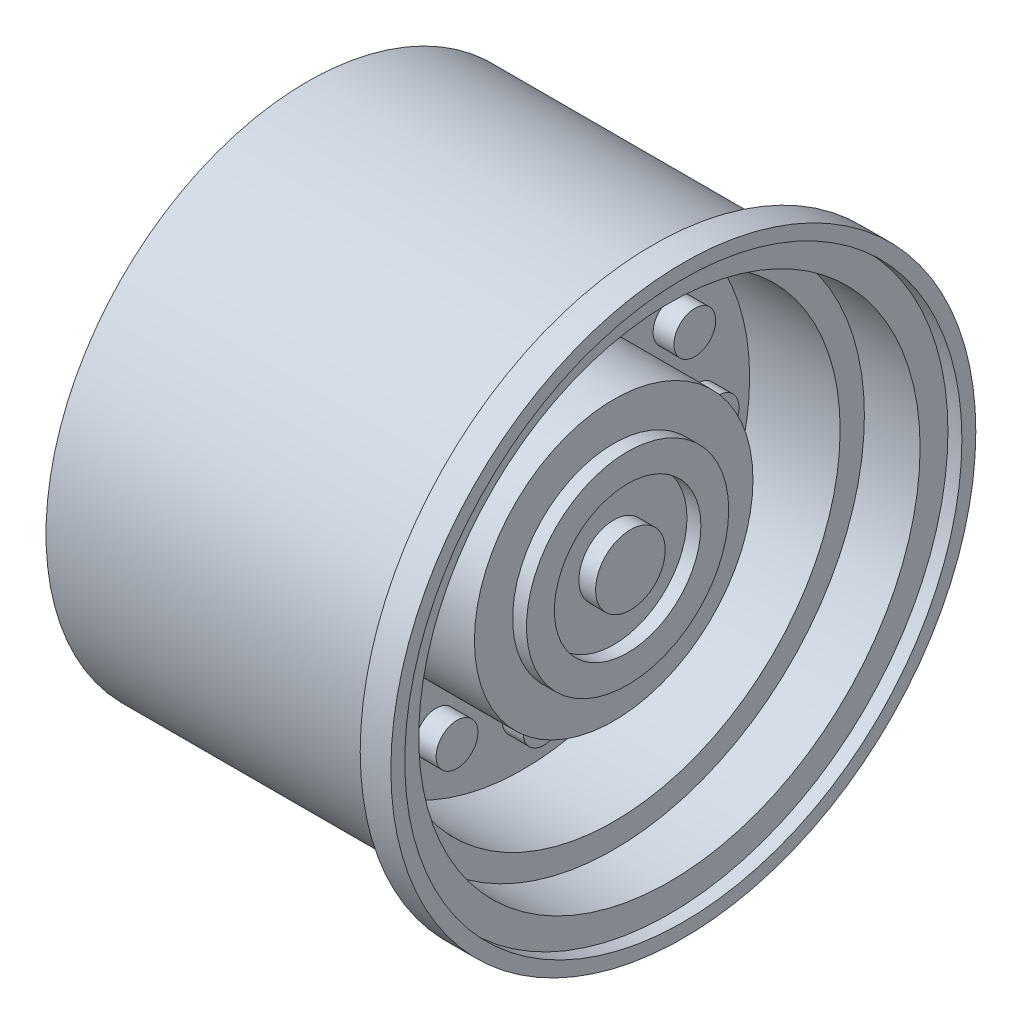
ISO-10303-21;
HEADER;
FILE_DESCRIPTION(('STEP AP214'),'2;1');
FILE_NAME('part.step','',(''),(''),'','','');
FILE_SCHEMA(('AUTOMOTIVE_DESIGN { 1 0 10303 214 1 1 1 1 }'));
ENDSEC;
DATA;
#1=APPLICATION_CONTEXT('core data for automotive mechanical design processes');
#2=APPLICATION_PROTOCOL_DEFINITION('international standard','automotive_design',2000,#1);
#3=PRODUCT_CONTEXT('',#1,'mechanical');
#4=PRODUCT('Part','Part','',(#3));
#5=PRODUCT_RELATED_PRODUCT_CATEGORY('part','',(#4));
#6=PRODUCT_DEFINITION_FORMATION('','',#4);
#7=PRODUCT_DEFINITION_CONTEXT('part definition',#1,'design');
#8=PRODUCT_DEFINITION('design','',#6,#7);
#9=PRODUCT_DEFINITION_SHAPE('','',#8);
#10=(LENGTH_UNIT() NAMED_UNIT(*) SI_UNIT(.MILLI.,.METRE.));
#11=(NAMED_UNIT(*) PLANE_ANGLE_UNIT() SI_UNIT($,.RADIAN.));
#12=(NAMED_UNIT(*) SI_UNIT($,.STERADIAN.) SOLID_ANGLE_UNIT());
#13=UNCERTAINTY_MEASURE_WITH_UNIT(LENGTH_MEASURE(1.E-05),#10,'distance_accuracy_value','');
#14=(GEOMETRIC_REPRESENTATION_CONTEXT(3) GLOBAL_UNCERTAINTY_ASSIGNED_CONTEXT((#13)) GLOBAL_UNIT_ASSIGNED_CONTEXT((#10,
#11,#12)) REPRESENTATION_CONTEXT('',''));
#15=CARTESIAN_POINT('',(0.,0.,0.));
#16=DIRECTION('',(0.,0.,1.));
#17=DIRECTION('',(1.,0.,0.));
#18=AXIS2_PLACEMENT_3D('',#15,#16,#17);
#19=CARTESIAN_POINT('',(4.69,3.63,0.));
#20=DIRECTION('',(1.,0.,0.));
#21=DIRECTION('',(0.,0.,-1.));
#22=AXIS2_PLACEMENT_3D('',#19,#20,#21);
#23=PLANE('',#22);
#24=CARTESIAN_POINT('',(4.69,0.,0.));
#25=DIRECTION('',(1.,0.,0.));
#26=DIRECTION('',(0.,0.,-1.));
#27=AXIS2_PLACEMENT_3D('',#24,#25,#26);
#28=CIRCLE('',#27,2.63);
#29=CARTESIAN_POINT('',(4.69,0.,-2.63));
#30=VERTEX_POINT('',#29);
#31=EDGE_CURVE('E179',#30,#30,#28,.T.);
#32=ORIENTED_EDGE('',*,*,#31,.F.);
#33=EDGE_LOOP('',(#32));
#34=FACE_BOUND('',#33,.T.);
#35=CARTESIAN_POINT('',(4.69,0.,0.));
#36=DIRECTION('',(1.,0.,0.));
#37=DIRECTION('',(0.,0.,-1.));
#38=AXIS2_PLACEMENT_3D('',#35,#36,#37);
#39=CIRCLE('',#38,3.63);
#40=CARTESIAN_POINT('',(4.69,0.,-3.63));
#41=VERTEX_POINT('',#40);
#42=EDGE_CURVE('E103',#41,#41,#39,.T.);
#43=ORIENTED_EDGE('',*,*,#42,.T.);
#44=EDGE_LOOP('',(#43));
#45=FACE_BOUND('',#44,.T.);
#46=ADVANCED_FACE('F33',(#34,#45),#23,.T.);
#47=CARTESIAN_POINT('',(-4.56,0.,0.));
#48=DIRECTION('',(-1.,0.,0.));
#49=DIRECTION('',(0.,0.,1.));
#50=AXIS2_PLACEMENT_3D('',#47,#48,#49);
#51=PLANE('',#50);
#52=CARTESIAN_POINT('',(-4.56,0.,0.));
#53=DIRECTION('',(-1.,0.,0.));
#54=DIRECTION('',(0.,0.,1.));
#55=AXIS2_PLACEMENT_3D('',#52,#53,#54);
#56=CIRCLE('',#55,1.25);
#57=CARTESIAN_POINT('',(-4.56,0.,1.25));
#58=VERTEX_POINT('',#57);
#59=EDGE_CURVE('E191',#58,#58,#56,.T.);
#60=ORIENTED_EDGE('',*,*,#59,.F.);
#61=EDGE_LOOP('',(#60));
#62=FACE_BOUND('',#61,.T.);
#63=CARTESIAN_POINT('',(-4.56,0.,0.));
#64=DIRECTION('',(1.,0.,0.));
#65=DIRECTION('',(0.,0.,-1.));
#66=AXIS2_PLACEMENT_3D('',#63,#64,#65);
#67=CIRCLE('',#66,3.25);
#68=CARTESIAN_POINT('',(-4.56,0.,-3.25));
#69=VERTEX_POINT('',#68);
#70=EDGE_CURVE('E10',#69,#69,#67,.T.);
#71=ORIENTED_EDGE('',*,*,#70,.F.);
#72=EDGE_LOOP('',(#71));
#73=FACE_BOUND('',#72,.T.);
#74=ADVANCED_FACE('F206',(#62,#73),#51,.T.);
#75=CARTESIAN_POINT('',(4.69,0.,0.));
#76=DIRECTION('',(1.,0.,0.));
#77=DIRECTION('',(0.,0.,-1.));
#78=AXIS2_PLACEMENT_3D('',#75,#76,#77);
#79=CYLINDRICAL_SURFACE('',#78,3.25);
#80=ORIENTED_EDGE('',*,*,#70,.T.);
#81=EDGE_LOOP('',(#80));
#82=FACE_BOUND('',#81,.T.);
#83=CARTESIAN_POINT('',(-3.81,0.,0.));
#84=DIRECTION('',(1.,0.,0.));
#85=DIRECTION('',(0.,0.,-1.));
#86=AXIS2_PLACEMENT_3D('',#83,#84,#85);
#87=CIRCLE('',#86,3.25);
#88=CARTESIAN_POINT('',(-3.81,0.,-3.25));
#89=VERTEX_POINT('',#88);
#90=EDGE_CURVE('E39',#89,#89,#87,.T.);
#91=ORIENTED_EDGE('',*,*,#90,.F.);
#92=EDGE_LOOP('',(#91));
#93=FACE_BOUND('',#92,.T.);
#94=ADVANCED_FACE('F209',(#82,#93),#79,.T.);
#95=CARTESIAN_POINT('',(-3.81,3.25,0.));
#96=DIRECTION('',(-1.,0.,0.));
#97=DIRECTION('',(0.,0.,1.));
#98=AXIS2_PLACEMENT_3D('',#95,#96,#97);
#99=PLANE('',#98);
#100=ORIENTED_EDGE('',*,*,#90,.T.);
#101=EDGE_LOOP('',(#100));
#102=FACE_BOUND('',#101,.T.);
#103=CARTESIAN_POINT('',(-3.81,0.,0.));
#104=DIRECTION('',(1.,0.,0.));
#105=DIRECTION('',(0.,0.,-1.));
#106=AXIS2_PLACEMENT_3D('',#103,#104,#105);
#107=CIRCLE('',#106,4.5);
#108=CARTESIAN_POINT('',(-3.81,0.,-4.5));
#109=VERTEX_POINT('',#108);
#110=EDGE_CURVE('E43',#109,#109,#107,.T.);
#111=ORIENTED_EDGE('',*,*,#110,.F.);
#112=EDGE_LOOP('',(#111));
#113=FACE_BOUND('',#112,.T.);
#114=ADVANCED_FACE('F214',(#102,#113),#99,.T.);
#115=CARTESIAN_POINT('',(4.69,0.,0.));
#116=DIRECTION('',(1.,0.,0.));
#117=DIRECTION('',(0.,0.,-1.));
#118=AXIS2_PLACEMENT_3D('',#115,#116,#117);
#119=CYLINDRICAL_SURFACE('',#118,4.5);
#120=ORIENTED_EDGE('',*,*,#110,.T.);
#121=EDGE_LOOP('',(#120));
#122=FACE_BOUND('',#121,.T.);
#123=CARTESIAN_POINT('',(-2.91,0.,0.));
#124=DIRECTION('',(1.,0.,0.));
#125=DIRECTION('',(0.,0.,-1.));
#126=AXIS2_PLACEMENT_3D('',#123,#124,#125);
#127=CIRCLE('',#126,4.5);
#128=CARTESIAN_POINT('',(-2.91,0.,-4.5));
#129=VERTEX_POINT('',#128);
#130=EDGE_CURVE('E47',#129,#129,#127,.T.);
#131=ORIENTED_EDGE('',*,*,#130,.F.);
#132=EDGE_LOOP('',(#131));
#133=FACE_BOUND('',#132,.T.);
#134=ADVANCED_FACE('F220',(#122,#133),#119,.T.);
#135=CARTESIAN_POINT('',(-2.91,4.5,0.));
#136=DIRECTION('',(-1.,0.,0.));
#137=DIRECTION('',(0.,0.,1.));
#138=AXIS2_PLACEMENT_3D('',#135,#136,#137);
#139=PLANE('',#138);
#140=ORIENTED_EDGE('',*,*,#130,.T.);
#141=EDGE_LOOP('',(#140));
#142=FACE_BOUND('',#141,.T.);
#143=CARTESIAN_POINT('',(-2.91,0.,0.));
#144=DIRECTION('',(1.,0.,0.));
#145=DIRECTION('',(0.,0.,-1.));
#146=AXIS2_PLACEMENT_3D('',#143,#144,#145);
#147=CIRCLE('',#146,8.13);
#148=CARTESIAN_POINT('',(-2.91,0.,-8.13));
#149=VERTEX_POINT('',#148);
#150=EDGE_CURVE('E52',#149,#149,#147,.T.);
#151=ORIENTED_EDGE('',*,*,#150,.F.);
#152=EDGE_LOOP('',(#151));
#153=FACE_BOUND('',#152,.T.);
#154=ADVANCED_FACE('F223',(#142,#153),#139,.T.);
#155=CARTESIAN_POINT('',(4.69,0.,0.));
#156=DIRECTION('',(1.,0.,0.));
#157=DIRECTION('',(0.,0.,-1.));
#158=AXIS2_PLACEMENT_3D('',#155,#156,#157);
#159=CYLINDRICAL_SURFACE('',#158,8.13);
#160=ORIENTED_EDGE('',*,*,#150,.T.);
#161=EDGE_LOOP('',(#160));
#162=FACE_BOUND('',#161,.T.);
#163=CARTESIAN_POINT('',(-5.31,0.,0.));
#164=DIRECTION('',(1.,0.,0.));
#165=DIRECTION('',(0.,0.,-1.));
#166=AXIS2_PLACEMENT_3D('',#163,#164,#165);
#167=CIRCLE('',#166,8.13);
#168=CARTESIAN_POINT('',(-5.31,0.,-8.13));
#169=VERTEX_POINT('',#168);
#170=EDGE_CURVE('E55',#169,#169,#167,.T.);
#171=ORIENTED_EDGE('',*,*,#170,.F.);
#172=EDGE_LOOP('',(#171));
#173=FACE_BOUND('',#172,.T.);
#174=ADVANCED_FACE('F227',(#162,#173),#159,.F.);
#175=CARTESIAN_POINT('',(-5.31,8.13,0.));
#176=DIRECTION('',(-1.,0.,0.));
#177=DIRECTION('',(0.,0.,1.));
#178=AXIS2_PLACEMENT_3D('',#175,#176,#177);
#179=PLANE('',#178);
#180=ORIENTED_EDGE('',*,*,#170,.T.);
#181=EDGE_LOOP('',(#180));
#182=FACE_BOUND('',#181,.T.);
#183=CARTESIAN_POINT('',(-5.31,0.,0.));
#184=DIRECTION('',(1.,0.,0.));
#185=DIRECTION('',(0.,0.,-1.));
#186=AXIS2_PLACEMENT_3D('',#183,#184,#185);
#187=CIRCLE('',#186,8.5);
#188=CARTESIAN_POINT('',(-5.31,0.,-8.5));
#189=VERTEX_POINT('',#188);
#190=EDGE_CURVE('E58',#189,#189,#187,.T.);
#191=ORIENTED_EDGE('',*,*,#190,.F.);
#192=EDGE_LOOP('',(#191));
#193=FACE_BOUND('',#192,.T.);
#194=ADVANCED_FACE('F231',(#182,#193),#179,.T.);
#195=CARTESIAN_POINT('',(4.69,0.,0.));
#196=DIRECTION('',(1.,0.,0.));
#197=DIRECTION('',(0.,0.,-1.));
#198=AXIS2_PLACEMENT_3D('',#195,#196,#197);
#199=CYLINDRICAL_SURFACE('',#198,8.5);
#200=ORIENTED_EDGE('',*,*,#190,.T.);
#201=EDGE_LOOP('',(#200));
#202=FACE_BOUND('',#201,.T.);
#203=CARTESIAN_POINT('',(-6.81,0.,0.));
#204=DIRECTION('',(1.,0.,0.));
#205=DIRECTION('',(0.,0.,-1.));
#206=AXIS2_PLACEMENT_3D('',#203,#204,#205);
#207=CIRCLE('',#206,8.5);
#208=CARTESIAN_POINT('',(-6.81,0.,-8.5));
#209=VERTEX_POINT('',#208);
#210=EDGE_CURVE('E61',#209,#209,#207,.T.);
#211=ORIENTED_EDGE('',*,*,#210,.F.);
#212=EDGE_LOOP('',(#211));
#213=FACE_BOUND('',#212,.T.);
#214=ADVANCED_FACE('F235',(#202,#213),#199,.F.);
#215=CARTESIAN_POINT('',(-6.81,8.5,0.));
#216=DIRECTION('',(-1.,0.,0.));
#217=DIRECTION('',(0.,0.,1.));
#218=AXIS2_PLACEMENT_3D('',#215,#216,#217);
#219=PLANE('',#218);
#220=ORIENTED_EDGE('',*,*,#210,.T.);
#221=EDGE_LOOP('',(#220));
#222=FACE_BOUND('',#221,.T.);
#223=CARTESIAN_POINT('',(-6.81,0.,0.));
#224=DIRECTION('',(1.,0.,0.));
#225=DIRECTION('',(0.,0.,-1.));
#226=AXIS2_PLACEMENT_3D('',#223,#224,#225);
#227=CIRCLE('',#226,9.38);
#228=CARTESIAN_POINT('',(-6.81,0.,-9.38));
#229=VERTEX_POINT('',#228);
#230=EDGE_CURVE('E64',#229,#229,#227,.T.);
#231=ORIENTED_EDGE('',*,*,#230,.F.);
#232=EDGE_LOOP('',(#231));
#233=FACE_BOUND('',#232,.T.);
#234=ADVANCED_FACE('F239',(#222,#233),#219,.T.);
#235=CARTESIAN_POINT('',(4.69,0.,0.));
#236=DIRECTION('',(1.,0.,0.));
#237=DIRECTION('',(0.,0.,-1.));
#238=AXIS2_PLACEMENT_3D('',#235,#236,#237);
#239=CYLINDRICAL_SURFACE('',#238,9.38);
#240=ORIENTED_EDGE('',*,*,#230,.T.);
#241=EDGE_LOOP('',(#240));
#242=FACE_BOUND('',#241,.T.);
#243=CARTESIAN_POINT('',(5.59,0.,0.));
#244=DIRECTION('',(1.,0.,0.));
#245=DIRECTION('',(0.,0.,-1.));
#246=AXIS2_PLACEMENT_3D('',#243,#244,#245);
#247=CIRCLE('',#246,9.38);
#248=CARTESIAN_POINT('',(5.59,0.,-9.38));
#249=VERTEX_POINT('',#248);
#250=EDGE_CURVE('E67',#249,#249,#247,.T.);
#251=ORIENTED_EDGE('',*,*,#250,.F.);
#252=EDGE_LOOP('',(#251));
#253=FACE_BOUND('',#252,.T.);
#254=ADVANCED_FACE('F243',(#242,#253),#239,.T.);
#255=CARTESIAN_POINT('',(5.59,9.38,0.));
#256=DIRECTION('',(-1.,0.,0.));
#257=DIRECTION('',(0.,0.,1.));
#258=AXIS2_PLACEMENT_3D('',#255,#256,#257);
#259=PLANE('',#258);
#260=ORIENTED_EDGE('',*,*,#250,.T.);
#261=EDGE_LOOP('',(#260));
#262=FACE_BOUND('',#261,.T.);
#263=CARTESIAN_POINT('',(5.59,0.,0.));
#264=DIRECTION('',(1.,0.,0.));
#265=DIRECTION('',(0.,0.,-1.));
#266=AXIS2_PLACEMENT_3D('',#263,#264,#265);
#267=CIRCLE('',#266,10.5);
#268=CARTESIAN_POINT('',(5.59,0.,-10.5));
#269=VERTEX_POINT('',#268);
#270=EDGE_CURVE('E70',#269,#269,#267,.T.);
#271=ORIENTED_EDGE('',*,*,#270,.F.);
#272=EDGE_LOOP('',(#271));
#273=FACE_BOUND('',#272,.T.);
#274=ADVANCED_FACE('F247',(#262,#273),#259,.T.);
#275=CARTESIAN_POINT('',(4.69,0.,0.));
#276=DIRECTION('',(1.,0.,0.));
#277=DIRECTION('',(0.,0.,-1.));
#278=AXIS2_PLACEMENT_3D('',#275,#276,#277);
#279=CYLINDRICAL_SURFACE('',#278,10.5);
#280=ORIENTED_EDGE('',*,*,#270,.T.);
#281=EDGE_LOOP('',(#280));
#282=FACE_BOUND('',#281,.T.);
#283=CARTESIAN_POINT('',(6.69,0.,0.));
#284=DIRECTION('',(1.,0.,0.));
#285=DIRECTION('',(0.,0.,-1.));
#286=AXIS2_PLACEMENT_3D('',#283,#284,#285);
#287=CIRCLE('',#286,10.5);
#288=CARTESIAN_POINT('',(6.69,0.,-10.5));
#289=VERTEX_POINT('',#288);
#290=EDGE_CURVE('E73',#289,#289,#287,.T.);
#291=ORIENTED_EDGE('',*,*,#290,.F.);
#292=EDGE_LOOP('',(#291));
#293=FACE_BOUND('',#292,.T.);
#294=ADVANCED_FACE('F251',(#282,#293),#279,.T.);
#295=CARTESIAN_POINT('',(6.69,10.5,0.));
#296=DIRECTION('',(1.,0.,0.));
#297=DIRECTION('',(0.,0.,-1.));
#298=AXIS2_PLACEMENT_3D('',#295,#296,#297);
#299=PLANE('',#298);
#300=ORIENTED_EDGE('',*,*,#290,.T.);
#301=EDGE_LOOP('',(#300));
#302=FACE_BOUND('',#301,.T.);
#303=CARTESIAN_POINT('',(6.69,0.,0.));
#304=DIRECTION('',(1.,0.,0.));
#305=DIRECTION('',(0.,0.,-1.));
#306=AXIS2_PLACEMENT_3D('',#303,#304,#305);
#307=CIRCLE('',#306,10.);
#308=CARTESIAN_POINT('',(6.69,0.,-10.));
#309=VERTEX_POINT('',#308);
#310=EDGE_CURVE('E76',#309,#309,#307,.T.);
#311=ORIENTED_EDGE('',*,*,#310,.F.);
#312=EDGE_LOOP('',(#311));
#313=FACE_BOUND('',#312,.T.);
#314=ADVANCED_FACE('F255',(#302,#313),#299,.T.);
#315=CARTESIAN_POINT('',(4.69,0.,0.));
#316=DIRECTION('',(1.,0.,0.));
#317=DIRECTION('',(0.,0.,-1.));
#318=AXIS2_PLACEMENT_3D('',#315,#316,#317);
#319=CYLINDRICAL_SURFACE('',#318,10.);
#320=ORIENTED_EDGE('',*,*,#310,.T.);
#321=EDGE_LOOP('',(#320));
#322=FACE_BOUND('',#321,.T.);
#323=CARTESIAN_POINT('',(6.19,0.,0.));
#324=DIRECTION('',(1.,0.,0.));
#325=DIRECTION('',(0.,0.,-1.));
#326=AXIS2_PLACEMENT_3D('',#323,#324,#325);
#327=CIRCLE('',#326,10.);
#328=CARTESIAN_POINT('',(6.19,0.,-10.));
#329=VERTEX_POINT('',#328);
#330=EDGE_CURVE('E79',#329,#329,#327,.T.);
#331=ORIENTED_EDGE('',*,*,#330,.F.);
#332=EDGE_LOOP('',(#331));
#333=FACE_BOUND('',#332,.T.);
#334=ADVANCED_FACE('F259',(#322,#333),#319,.F.);
#335=CARTESIAN_POINT('',(6.19,10.,0.));
#336=DIRECTION('',(1.,0.,0.));
#337=DIRECTION('',(0.,0.,-1.));
#338=AXIS2_PLACEMENT_3D('',#335,#336,#337);
#339=PLANE('',#338);
#340=ORIENTED_EDGE('',*,*,#330,.T.);
#341=EDGE_LOOP('',(#340));
#342=FACE_BOUND('',#341,.T.);
#343=CARTESIAN_POINT('',(6.19,0.,0.));
#344=DIRECTION('',(1.,0.,0.));
#345=DIRECTION('',(0.,0.,-1.));
#346=AXIS2_PLACEMENT_3D('',#343,#344,#345);
#347=CIRCLE('',#346,9.);
#348=CARTESIAN_POINT('',(6.19,0.,-9.));
#349=VERTEX_POINT('',#348);
#350=EDGE_CURVE('E82',#349,#349,#347,.T.);
#351=ORIENTED_EDGE('',*,*,#350,.F.);
#352=EDGE_LOOP('',(#351));
#353=FACE_BOUND('',#352,.T.);
#354=ADVANCED_FACE('F263',(#342,#353),#339,.T.);
#355=CARTESIAN_POINT('',(4.69,0.,0.));
#356=DIRECTION('',(1.,0.,0.));
#357=DIRECTION('',(0.,0.,-1.));
#358=AXIS2_PLACEMENT_3D('',#355,#356,#357);
#359=CYLINDRICAL_SURFACE('',#358,9.);
#360=ORIENTED_EDGE('',*,*,#350,.T.);
#361=EDGE_LOOP('',(#360));
#362=FACE_BOUND('',#361,.T.);
#363=CARTESIAN_POINT('',(4.19,0.,0.));
#364=DIRECTION('',(1.,0.,0.));
#365=DIRECTION('',(0.,0.,-1.));
#366=AXIS2_PLACEMENT_3D('',#363,#364,#365);
#367=CIRCLE('',#366,9.);
#368=CARTESIAN_POINT('',(4.19,0.,-9.));
#369=VERTEX_POINT('',#368);
#370=EDGE_CURVE('E85',#369,#369,#367,.T.);
#371=ORIENTED_EDGE('',*,*,#370,.F.);
#372=EDGE_LOOP('',(#371));
#373=FACE_BOUND('',#372,.T.);
#374=ADVANCED_FACE('F267',(#362,#373),#359,.F.);
#375=CARTESIAN_POINT('',(4.19,9.,0.));
#376=DIRECTION('',(1.,0.,0.));
#377=DIRECTION('',(0.,0.,-1.));
#378=AXIS2_PLACEMENT_3D('',#375,#376,#377);
#379=PLANE('',#378);
#380=ORIENTED_EDGE('',*,*,#370,.T.);
#381=EDGE_LOOP('',(#380));
#382=FACE_BOUND('',#381,.T.);
#383=CARTESIAN_POINT('',(4.19,0.,0.));
#384=DIRECTION('',(1.,0.,0.));
#385=DIRECTION('',(0.,0.,-1.));
#386=AXIS2_PLACEMENT_3D('',#383,#384,#385);
#387=CIRCLE('',#386,8.13);
#388=CARTESIAN_POINT('',(4.19,0.,-8.13));
#389=VERTEX_POINT('',#388);
#390=EDGE_CURVE('E88',#389,#389,#387,.T.);
#391=ORIENTED_EDGE('',*,*,#390,.F.);
#392=EDGE_LOOP('',(#391));
#393=FACE_BOUND('',#392,.T.);
#394=ADVANCED_FACE('F271',(#382,#393),#379,.T.);
#395=CARTESIAN_POINT('',(4.69,0.,0.));
#396=DIRECTION('',(1.,0.,0.));
#397=DIRECTION('',(0.,0.,-1.));
#398=AXIS2_PLACEMENT_3D('',#395,#396,#397);
#399=CYLINDRICAL_SURFACE('',#398,8.13);
#400=ORIENTED_EDGE('',*,*,#390,.T.);
#401=EDGE_LOOP('',(#400));
#402=FACE_BOUND('',#401,.T.);
#403=CARTESIAN_POINT('',(0.940000000000001,0.,0.));
#404=DIRECTION('',(1.,0.,0.));
#405=DIRECTION('',(0.,0.,-1.));
#406=AXIS2_PLACEMENT_3D('',#403,#404,#405);
#407=CIRCLE('',#406,8.13);
#408=CARTESIAN_POINT('',(0.940000000000001,0.,-8.13));
#409=VERTEX_POINT('',#408);
#410=EDGE_CURVE('E91',#409,#409,#407,.T.);
#411=ORIENTED_EDGE('',*,*,#410,.F.);
#412=EDGE_LOOP('',(#411));
#413=FACE_BOUND('',#412,.T.);
#414=ADVANCED_FACE('F275',(#402,#413),#399,.F.);
#415=CARTESIAN_POINT('',(0.940000000000001,8.13,0.));
#416=DIRECTION('',(1.,0.,0.));
#417=DIRECTION('',(0.,0.,-1.));
#418=AXIS2_PLACEMENT_3D('',#415,#416,#417);
#419=PLANE('',#418);
#420=CARTESIAN_POINT('',(0.940000000000001,5.41265877365261,3.12499999999997));
#421=DIRECTION('',(1.,0.,0.));
#422=DIRECTION('',(0.,0.,-1.));
#423=AXIS2_PLACEMENT_3D('',#420,#421,#422);
#424=CIRCLE('',#423,0.750000000000153);
#425=CARTESIAN_POINT('',(0.940000000000001,5.41265877365261,2.37499999999981));
#426=VERTEX_POINT('',#425);
#427=EDGE_CURVE('E173',#426,#426,#424,.T.);
#428=ORIENTED_EDGE('',*,*,#427,.F.);
#429=EDGE_LOOP('',(#428));
#430=FACE_BOUND('',#429,.T.);
#431=CARTESIAN_POINT('',(0.940000000000001,3.12499999999977,5.41265877365261));
#432=DIRECTION('',(1.,0.,0.));
#433=DIRECTION('',(0.,0.,-1.));
#434=AXIS2_PLACEMENT_3D('',#431,#432,#433);
#435=CIRCLE('',#434,0.750000000000268);
#436=CARTESIAN_POINT('',(0.940000000000001,3.12499999999977,4.66265877365234));
#437=VERTEX_POINT('',#436);
#438=EDGE_CURVE('E167',#437,#437,#435,.T.);
#439=ORIENTED_EDGE('',*,*,#438,.F.);
#440=EDGE_LOOP('',(#439));
#441=FACE_BOUND('',#440,.T.);
#442=CARTESIAN_POINT('',(0.940000000000001,-2.66070823785304E-13,6.24999999999974));
#443=DIRECTION('',(1.,0.,0.));
#444=DIRECTION('',(0.,0.,-1.));
#445=AXIS2_PLACEMENT_3D('',#442,#443,#444);
#446=CIRCLE('',#445,0.750000000000394);
#447=CARTESIAN_POINT('',(0.940000000000001,-2.66070823785304E-13,5.49999999999934));
#448=VERTEX_POINT('',#447);
#449=EDGE_CURVE('E161',#448,#448,#446,.T.);
#450=ORIENTED_EDGE('',*,*,#449,.F.);
#451=EDGE_LOOP('',(#450));
#452=FACE_BOUND('',#451,.T.);
#453=CARTESIAN_POINT('',(0.940000000000001,-3.12500000000023,5.41265877365234));
#454=DIRECTION('',(1.,0.,0.));
#455=DIRECTION('',(0.,0.,-1.));
#456=AXIS2_PLACEMENT_3D('',#453,#454,#455);
#457=CIRCLE('',#456,0.750000000000506);
#458=CARTESIAN_POINT('',(0.940000000000001,-3.12500000000023,4.66265877365184));
#459=VERTEX_POINT('',#458);
#460=EDGE_CURVE('E155',#459,#459,#457,.T.);
#461=ORIENTED_EDGE('',*,*,#460,.F.);
#462=EDGE_LOOP('',(#461));
#463=FACE_BOUND('',#462,.T.);
#464=CARTESIAN_POINT('',(0.940000000000001,-5.41265877365288,3.1249999999995));
#465=DIRECTION('',(1.,0.,0.));
#466=DIRECTION('',(0.,0.,-1.));
#467=AXIS2_PLACEMENT_3D('',#464,#465,#466);
#468=CIRCLE('',#467,0.750000000000563);
#469=CARTESIAN_POINT('',(0.940000000000001,-5.41265877365288,2.37499999999894));
#470=VERTEX_POINT('',#469);
#471=EDGE_CURVE('E149',#470,#470,#468,.T.);
#472=ORIENTED_EDGE('',*,*,#471,.F.);
#473=EDGE_LOOP('',(#472));
#474=FACE_BOUND('',#473,.T.);
#475=CARTESIAN_POINT('',(0.940000000000001,-6.25,-5.30610839071674E-13));
#476=DIRECTION('',(1.,0.,0.));
#477=DIRECTION('',(0.,0.,-1.));
#478=AXIS2_PLACEMENT_3D('',#475,#476,#477);
#479=CIRCLE('',#478,0.750000000000549);
#480=CARTESIAN_POINT('',(0.940000000000001,-6.25,-0.75000000000108));
#481=VERTEX_POINT('',#480);
#482=EDGE_CURVE('E143',#481,#481,#479,.T.);
#483=ORIENTED_EDGE('',*,*,#482,.F.);
#484=EDGE_LOOP('',(#483));
#485=FACE_BOUND('',#484,.T.);
#486=CARTESIAN_POINT('',(0.940000000000001,-5.41265877365261,-3.1250000000005));
#487=DIRECTION('',(1.,0.,0.));
#488=DIRECTION('',(0.,0.,-1.));
#489=AXIS2_PLACEMENT_3D('',#486,#487,#488);
#490=CIRCLE('',#489,0.750000000000473);
#491=CARTESIAN_POINT('',(0.940000000000001,-5.41265877365261,-3.87500000000097));
#492=VERTEX_POINT('',#491);
#493=EDGE_CURVE('E137',#492,#492,#490,.T.);
#494=ORIENTED_EDGE('',*,*,#493,.F.);
#495=EDGE_LOOP('',(#494));
#496=FACE_BOUND('',#495,.T.);
#497=CARTESIAN_POINT('',(0.940000000000001,-3.12499999999977,-5.41265877365314));
#498=DIRECTION('',(1.,0.,0.));
#499=DIRECTION('',(0.,0.,-1.));
#500=AXIS2_PLACEMENT_3D('',#497,#498,#499);
#501=CIRCLE('',#500,0.750000000000343);
#502=CARTESIAN_POINT('',(0.940000000000001,-3.12499999999977,-6.16265877365348));
#503=VERTEX_POINT('',#502);
#504=EDGE_CURVE('E131',#503,#503,#501,.T.);
#505=ORIENTED_EDGE('',*,*,#504,.F.);
#506=EDGE_LOOP('',(#505));
#507=FACE_BOUND('',#506,.T.);
#508=CARTESIAN_POINT('',(0.940000000000001,2.65305419535837E-13,-6.25000000000026));
#509=DIRECTION('',(1.,0.,0.));
#510=DIRECTION('',(0.,0.,-1.));
#511=AXIS2_PLACEMENT_3D('',#508,#509,#510);
#512=CIRCLE('',#511,0.750000000000197);
#513=CARTESIAN_POINT('',(0.940000000000001,2.65305419535837E-13,-7.00000000000046));
#514=VERTEX_POINT('',#513);
#515=EDGE_CURVE('E125',#514,#514,#512,.T.);
#516=ORIENTED_EDGE('',*,*,#515,.F.);
#517=EDGE_LOOP('',(#516));
#518=FACE_BOUND('',#517,.T.);
#519=CARTESIAN_POINT('',(0.940000000000001,3.12500000000023,-5.41265877365287));
#520=DIRECTION('',(1.,0.,0.));
#521=DIRECTION('',(0.,0.,-1.));
#522=AXIS2_PLACEMENT_3D('',#519,#520,#521);
#523=CIRCLE('',#522,0.750000000000074);
#524=CARTESIAN_POINT('',(0.940000000000001,3.12500000000023,-6.16265877365295));
#525=VERTEX_POINT('',#524);
#526=EDGE_CURVE('E119',#525,#525,#523,.T.);
#527=ORIENTED_EDGE('',*,*,#526,.F.);
#528=EDGE_LOOP('',(#527));
#529=FACE_BOUND('',#528,.T.);
#530=CARTESIAN_POINT('',(0.940000000000001,5.41265877365274,-3.12500000000001));
#531=DIRECTION('',(1.,0.,0.));
#532=DIRECTION('',(0.,0.,-1.));
#533=AXIS2_PLACEMENT_3D('',#530,#531,#532);
#534=CIRCLE('',#533,0.75);
#535=CARTESIAN_POINT('',(0.940000000000001,5.41265877365274,-3.87500000000001));
#536=VERTEX_POINT('',#535);
#537=EDGE_CURVE('E113',#536,#536,#534,.T.);
#538=ORIENTED_EDGE('',*,*,#537,.F.);
#539=EDGE_LOOP('',(#538));
#540=FACE_BOUND('',#539,.T.);
#541=CARTESIAN_POINT('',(0.940000000000001,6.25,0.));
#542=DIRECTION('',(1.,0.,0.));
#543=DIRECTION('',(0.,0.,-1.));
#544=AXIS2_PLACEMENT_3D('',#541,#542,#543);
#545=CIRCLE('',#544,0.75);
#546=CARTESIAN_POINT('',(0.940000000000001,6.25,-0.75));
#547=VERTEX_POINT('',#546);
#548=EDGE_CURVE('E107',#547,#547,#545,.T.);
#549=ORIENTED_EDGE('',*,*,#548,.F.);
#550=EDGE_LOOP('',(#549));
#551=FACE_BOUND('',#550,.T.);
#552=ORIENTED_EDGE('',*,*,#410,.T.);
#553=EDGE_LOOP('',(#552));
#554=FACE_BOUND('',#553,.T.);
#555=CARTESIAN_POINT('',(0.940000000000001,0.,0.));
#556=DIRECTION('',(1.,0.,0.));
#557=DIRECTION('',(0.,0.,-1.));
#558=AXIS2_PLACEMENT_3D('',#555,#556,#557);
#559=CIRCLE('',#558,5.);
#560=CARTESIAN_POINT('',(0.940000000000001,0.,-5.));
#561=VERTEX_POINT('',#560);
#562=EDGE_CURVE('E94',#561,#561,#559,.T.);
#563=ORIENTED_EDGE('',*,*,#562,.F.);
#564=EDGE_LOOP('',(#563));
#565=FACE_BOUND('',#564,.T.);
#566=ADVANCED_FACE('F279',(#430,#441,#452,#463,#474,#485,#496,#507,#518,#529,#540,#551,#554,
#565),#419,.T.);
#567=CARTESIAN_POINT('',(4.69,0.,0.));
#568=DIRECTION('',(1.,0.,0.));
#569=DIRECTION('',(0.,0.,-1.));
#570=AXIS2_PLACEMENT_3D('',#567,#568,#569);
#571=CYLINDRICAL_SURFACE('',#570,5.);
#572=ORIENTED_EDGE('',*,*,#562,.T.);
#573=EDGE_LOOP('',(#572));
#574=FACE_BOUND('',#573,.T.);
#575=CARTESIAN_POINT('',(4.19,0.,0.));
#576=DIRECTION('',(1.,0.,0.));
#577=DIRECTION('',(0.,0.,-1.));
#578=AXIS2_PLACEMENT_3D('',#575,#576,#577);
#579=CIRCLE('',#578,5.);
#580=CARTESIAN_POINT('',(4.19,0.,-5.));
#581=VERTEX_POINT('',#580);
#582=EDGE_CURVE('E97',#581,#581,#579,.T.);
#583=ORIENTED_EDGE('',*,*,#582,.F.);
#584=EDGE_LOOP('',(#583));
#585=FACE_BOUND('',#584,.T.);
#586=ADVANCED_FACE('F283',(#574,#585),#571,.T.);
#587=CARTESIAN_POINT('',(4.19,5.,0.));
#588=DIRECTION('',(1.,0.,0.));
#589=DIRECTION('',(0.,0.,-1.));
#590=AXIS2_PLACEMENT_3D('',#587,#588,#589);
#591=PLANE('',#590);
#592=ORIENTED_EDGE('',*,*,#582,.T.);
#593=EDGE_LOOP('',(#592));
#594=FACE_BOUND('',#593,.T.);
#595=CARTESIAN_POINT('',(4.19,0.,0.));
#596=DIRECTION('',(1.,0.,0.));
#597=DIRECTION('',(0.,0.,-1.));
#598=AXIS2_PLACEMENT_3D('',#595,#596,#597);
#599=CIRCLE('',#598,3.63);
#600=CARTESIAN_POINT('',(4.19,0.,-3.63));
#601=VERTEX_POINT('',#600);
#602=EDGE_CURVE('E100',#601,#601,#599,.T.);
#603=ORIENTED_EDGE('',*,*,#602,.F.);
#604=EDGE_LOOP('',(#603));
#605=FACE_BOUND('',#604,.T.);
#606=ADVANCED_FACE('F287',(#594,#605),#591,.T.);
#607=CARTESIAN_POINT('',(4.69,0.,0.));
#608=DIRECTION('',(1.,0.,0.));
#609=DIRECTION('',(0.,0.,-1.));
#610=AXIS2_PLACEMENT_3D('',#607,#608,#609);
#611=CYLINDRICAL_SURFACE('',#610,3.63);
#612=ORIENTED_EDGE('',*,*,#602,.T.);
#613=EDGE_LOOP('',(#612));
#614=FACE_BOUND('',#613,.T.);
#615=ORIENTED_EDGE('',*,*,#42,.F.);
#616=EDGE_LOOP('',(#615));
#617=FACE_BOUND('',#616,.T.);
#618=ADVANCED_FACE('F291',(#614,#617),#611,.T.);
#619=CARTESIAN_POINT('',(1.69,6.25,0.));
#620=DIRECTION('',(-1.,0.,0.));
#621=DIRECTION('',(0.,0.,1.));
#622=AXIS2_PLACEMENT_3D('',#619,#620,#621);
#623=CYLINDRICAL_SURFACE('',#622,0.75);
#624=CARTESIAN_POINT('',(1.69,6.25,0.));
#625=DIRECTION('',(1.,0.,0.));
#626=DIRECTION('',(0.,0.,-1.));
#627=AXIS2_PLACEMENT_3D('',#624,#625,#626);
#628=CIRCLE('',#627,0.75);
#629=CARTESIAN_POINT('',(1.69,6.25,-0.75));
#630=VERTEX_POINT('',#629);
#631=EDGE_CURVE('E106',#630,#630,#628,.T.);
#632=ORIENTED_EDGE('',*,*,#631,.F.);
#633=EDGE_LOOP('',(#632));
#634=FACE_BOUND('',#633,.T.);
#635=ORIENTED_EDGE('',*,*,#548,.T.);
#636=EDGE_LOOP('',(#635));
#637=FACE_BOUND('',#636,.T.);
#638=ADVANCED_FACE('F295',(#634,#637),#623,.T.);
#639=CARTESIAN_POINT('',(1.69,6.25,0.));
#640=DIRECTION('',(1.,0.,0.));
#641=DIRECTION('',(0.,0.,-1.));
#642=AXIS2_PLACEMENT_3D('',#639,#640,#641);
#643=PLANE('',#642);
#644=ORIENTED_EDGE('',*,*,#631,.T.);
#645=EDGE_LOOP('',(#644));
#646=FACE_BOUND('',#645,.T.);
#647=ADVANCED_FACE('F299',(#646),#643,.T.);
#648=CARTESIAN_POINT('',(1.69,5.41265877365274,-3.12500000000001));
#649=DIRECTION('',(-1.,0.,0.));
#650=DIRECTION('',(0.,0.,1.));
#651=AXIS2_PLACEMENT_3D('',#648,#649,#650);
#652=CYLINDRICAL_SURFACE('',#651,0.75);
#653=CARTESIAN_POINT('',(1.69,5.41265877365274,-3.12500000000001));
#654=DIRECTION('',(1.,0.,0.));
#655=DIRECTION('',(0.,0.,-1.));
#656=AXIS2_PLACEMENT_3D('',#653,#654,#655);
#657=CIRCLE('',#656,0.75);
#658=CARTESIAN_POINT('',(1.69,5.41265877365274,-3.87500000000001));
#659=VERTEX_POINT('',#658);
#660=EDGE_CURVE('E110',#659,#659,#657,.T.);
#661=ORIENTED_EDGE('',*,*,#660,.F.);
#662=EDGE_LOOP('',(#661));
#663=FACE_BOUND('',#662,.T.);
#664=ORIENTED_EDGE('',*,*,#537,.T.);
#665=EDGE_LOOP('',(#664));
#666=FACE_BOUND('',#665,.T.);
#667=ADVANCED_FACE('F303',(#663,#666),#652,.T.);
#668=CARTESIAN_POINT('',(1.69,5.41265877365274,-3.12500000000001));
#669=DIRECTION('',(1.,0.,0.));
#670=DIRECTION('',(0.,0.,-1.));
#671=AXIS2_PLACEMENT_3D('',#668,#669,#670);
#672=PLANE('',#671);
#673=ORIENTED_EDGE('',*,*,#660,.T.);
#674=EDGE_LOOP('',(#673));
#675=FACE_BOUND('',#674,.T.);
#676=ADVANCED_FACE('F307',(#675),#672,.T.);
#677=CARTESIAN_POINT('',(1.69,3.12500000000023,-5.41265877365287));
#678=DIRECTION('',(-1.,0.,0.));
#679=DIRECTION('',(0.,0.,1.));
#680=AXIS2_PLACEMENT_3D('',#677,#678,#679);
#681=CYLINDRICAL_SURFACE('',#680,0.750000000000074);
#682=CARTESIAN_POINT('',(1.69,3.12500000000023,-5.41265877365287));
#683=DIRECTION('',(1.,0.,0.));
#684=DIRECTION('',(0.,0.,-1.));
#685=AXIS2_PLACEMENT_3D('',#682,#683,#684);
#686=CIRCLE('',#685,0.750000000000074);
#687=CARTESIAN_POINT('',(1.69,3.12500000000023,-6.16265877365295));
#688=VERTEX_POINT('',#687);
#689=EDGE_CURVE('E116',#688,#688,#686,.T.);
#690=ORIENTED_EDGE('',*,*,#689,.F.);
#691=EDGE_LOOP('',(#690));
#692=FACE_BOUND('',#691,.T.);
#693=ORIENTED_EDGE('',*,*,#526,.T.);
#694=EDGE_LOOP('',(#693));
#695=FACE_BOUND('',#694,.T.);
#696=ADVANCED_FACE('F311',(#692,#695),#681,.T.);
#697=CARTESIAN_POINT('',(1.69,3.12500000000023,-5.41265877365287));
#698=DIRECTION('',(1.,0.,0.));
#699=DIRECTION('',(0.,0.,-1.));
#700=AXIS2_PLACEMENT_3D('',#697,#698,#699);
#701=PLANE('',#700);
#702=ORIENTED_EDGE('',*,*,#689,.T.);
#703=EDGE_LOOP('',(#702));
#704=FACE_BOUND('',#703,.T.);
#705=ADVANCED_FACE('F315',(#704),#701,.T.);
#706=CARTESIAN_POINT('',(1.69,2.65305419535837E-13,-6.25000000000026));
#707=DIRECTION('',(-1.,0.,0.));
#708=DIRECTION('',(0.,0.,1.));
#709=AXIS2_PLACEMENT_3D('',#706,#707,#708);
#710=CYLINDRICAL_SURFACE('',#709,0.750000000000197);
#711=CARTESIAN_POINT('',(1.69,2.65305419535837E-13,-6.25000000000026));
#712=DIRECTION('',(1.,0.,0.));
#713=DIRECTION('',(0.,0.,-1.));
#714=AXIS2_PLACEMENT_3D('',#711,#712,#713);
#715=CIRCLE('',#714,0.750000000000197);
#716=CARTESIAN_POINT('',(1.69,2.65305419535837E-13,-7.00000000000046));
#717=VERTEX_POINT('',#716);
#718=EDGE_CURVE('E122',#717,#717,#715,.T.);
#719=ORIENTED_EDGE('',*,*,#718,.F.);
#720=EDGE_LOOP('',(#719));
#721=FACE_BOUND('',#720,.T.);
#722=ORIENTED_EDGE('',*,*,#515,.T.);
#723=EDGE_LOOP('',(#722));
#724=FACE_BOUND('',#723,.T.);
#725=ADVANCED_FACE('F319',(#721,#724),#710,.T.);
#726=CARTESIAN_POINT('',(1.69,2.65305419535837E-13,-6.25000000000026));
#727=DIRECTION('',(1.,0.,0.));
#728=DIRECTION('',(0.,0.,-1.));
#729=AXIS2_PLACEMENT_3D('',#726,#727,#728);
#730=PLANE('',#729);
#731=ORIENTED_EDGE('',*,*,#718,.T.);
#732=EDGE_LOOP('',(#731));
#733=FACE_BOUND('',#732,.T.);
#734=ADVANCED_FACE('F323',(#733),#730,.T.);
#735=CARTESIAN_POINT('',(1.69,-3.12499999999977,-5.41265877365314));
#736=DIRECTION('',(-1.,0.,0.));
#737=DIRECTION('',(0.,0.,1.));
#738=AXIS2_PLACEMENT_3D('',#735,#736,#737);
#739=CYLINDRICAL_SURFACE('',#738,0.750000000000343);
#740=CARTESIAN_POINT('',(1.69,-3.12499999999977,-5.41265877365314));
#741=DIRECTION('',(1.,0.,0.));
#742=DIRECTION('',(0.,0.,-1.));
#743=AXIS2_PLACEMENT_3D('',#740,#741,#742);
#744=CIRCLE('',#743,0.750000000000343);
#745=CARTESIAN_POINT('',(1.69,-3.12499999999977,-6.16265877365348));
#746=VERTEX_POINT('',#745);
#747=EDGE_CURVE('E128',#746,#746,#744,.T.);
#748=ORIENTED_EDGE('',*,*,#747,.F.);
#749=EDGE_LOOP('',(#748));
#750=FACE_BOUND('',#749,.T.);
#751=ORIENTED_EDGE('',*,*,#504,.T.);
#752=EDGE_LOOP('',(#751));
#753=FACE_BOUND('',#752,.T.);
#754=ADVANCED_FACE('F327',(#750,#753),#739,.T.);
#755=CARTESIAN_POINT('',(1.69,-3.12499999999977,-5.41265877365314));
#756=DIRECTION('',(1.,0.,0.));
#757=DIRECTION('',(0.,0.,-1.));
#758=AXIS2_PLACEMENT_3D('',#755,#756,#757);
#759=PLANE('',#758);
#760=ORIENTED_EDGE('',*,*,#747,.T.);
#761=EDGE_LOOP('',(#760));
#762=FACE_BOUND('',#761,.T.);
#763=ADVANCED_FACE('F331',(#762),#759,.T.);
#764=CARTESIAN_POINT('',(1.69,-5.41265877365261,-3.1250000000005));
#765=DIRECTION('',(-1.,0.,0.));
#766=DIRECTION('',(0.,0.,1.));
#767=AXIS2_PLACEMENT_3D('',#764,#765,#766);
#768=CYLINDRICAL_SURFACE('',#767,0.750000000000473);
#769=CARTESIAN_POINT('',(1.69,-5.41265877365261,-3.1250000000005));
#770=DIRECTION('',(1.,0.,0.));
#771=DIRECTION('',(0.,0.,-1.));
#772=AXIS2_PLACEMENT_3D('',#769,#770,#771);
#773=CIRCLE('',#772,0.750000000000473);
#774=CARTESIAN_POINT('',(1.69,-5.41265877365261,-3.87500000000097));
#775=VERTEX_POINT('',#774);
#776=EDGE_CURVE('E134',#775,#775,#773,.T.);
#777=ORIENTED_EDGE('',*,*,#776,.F.);
#778=EDGE_LOOP('',(#777));
#779=FACE_BOUND('',#778,.T.);
#780=ORIENTED_EDGE('',*,*,#493,.T.);
#781=EDGE_LOOP('',(#780));
#782=FACE_BOUND('',#781,.T.);
#783=ADVANCED_FACE('F335',(#779,#782),#768,.T.);
#784=CARTESIAN_POINT('',(1.69,-5.41265877365261,-3.1250000000005));
#785=DIRECTION('',(1.,0.,0.));
#786=DIRECTION('',(0.,0.,-1.));
#787=AXIS2_PLACEMENT_3D('',#784,#785,#786);
#788=PLANE('',#787);
#789=ORIENTED_EDGE('',*,*,#776,.T.);
#790=EDGE_LOOP('',(#789));
#791=FACE_BOUND('',#790,.T.);
#792=ADVANCED_FACE('F339',(#791),#788,.T.);
#793=CARTESIAN_POINT('',(1.69,-6.25,-5.30610839071674E-13));
#794=DIRECTION('',(-1.,0.,0.));
#795=DIRECTION('',(0.,0.,1.));
#796=AXIS2_PLACEMENT_3D('',#793,#794,#795);
#797=CYLINDRICAL_SURFACE('',#796,0.750000000000549);
#798=CARTESIAN_POINT('',(1.69,-6.25,-5.30610839071674E-13));
#799=DIRECTION('',(1.,0.,0.));
#800=DIRECTION('',(0.,0.,-1.));
#801=AXIS2_PLACEMENT_3D('',#798,#799,#800);
#802=CIRCLE('',#801,0.750000000000549);
#803=CARTESIAN_POINT('',(1.69,-6.25,-0.75000000000108));
#804=VERTEX_POINT('',#803);
#805=EDGE_CURVE('E140',#804,#804,#802,.T.);
#806=ORIENTED_EDGE('',*,*,#805,.F.);
#807=EDGE_LOOP('',(#806));
#808=FACE_BOUND('',#807,.T.);
#809=ORIENTED_EDGE('',*,*,#482,.T.);
#810=EDGE_LOOP('',(#809));
#811=FACE_BOUND('',#810,.T.);
#812=ADVANCED_FACE('F343',(#808,#811),#797,.T.);
#813=CARTESIAN_POINT('',(1.69,-6.25,-5.30610839071674E-13));
#814=DIRECTION('',(1.,0.,0.));
#815=DIRECTION('',(0.,0.,-1.));
#816=AXIS2_PLACEMENT_3D('',#813,#814,#815);
#817=PLANE('',#816);
#818=ORIENTED_EDGE('',*,*,#805,.T.);
#819=EDGE_LOOP('',(#818));
#820=FACE_BOUND('',#819,.T.);
#821=ADVANCED_FACE('F347',(#820),#817,.T.);
#822=CARTESIAN_POINT('',(1.69,-5.41265877365288,3.1249999999995));
#823=DIRECTION('',(-1.,0.,0.));
#824=DIRECTION('',(0.,0.,1.));
#825=AXIS2_PLACEMENT_3D('',#822,#823,#824);
#826=CYLINDRICAL_SURFACE('',#825,0.750000000000563);
#827=CARTESIAN_POINT('',(1.69,-5.41265877365288,3.1249999999995));
#828=DIRECTION('',(1.,0.,0.));
#829=DIRECTION('',(0.,0.,-1.));
#830=AXIS2_PLACEMENT_3D('',#827,#828,#829);
#831=CIRCLE('',#830,0.750000000000563);
#832=CARTESIAN_POINT('',(1.69,-5.41265877365288,2.37499999999894));
#833=VERTEX_POINT('',#832);
#834=EDGE_CURVE('E146',#833,#833,#831,.T.);
#835=ORIENTED_EDGE('',*,*,#834,.F.);
#836=EDGE_LOOP('',(#835));
#837=FACE_BOUND('',#836,.T.);
#838=ORIENTED_EDGE('',*,*,#471,.T.);
#839=EDGE_LOOP('',(#838));
#840=FACE_BOUND('',#839,.T.);
#841=ADVANCED_FACE('F351',(#837,#840),#826,.T.);
#842=CARTESIAN_POINT('',(1.69,-5.41265877365288,3.1249999999995));
#843=DIRECTION('',(1.,0.,0.));
#844=DIRECTION('',(0.,0.,-1.));
#845=AXIS2_PLACEMENT_3D('',#842,#843,#844);
#846=PLANE('',#845);
#847=ORIENTED_EDGE('',*,*,#834,.T.);
#848=EDGE_LOOP('',(#847));
#849=FACE_BOUND('',#848,.T.);
#850=ADVANCED_FACE('F355',(#849),#846,.T.);
#851=CARTESIAN_POINT('',(1.69,-3.12500000000023,5.41265877365234));
#852=DIRECTION('',(-1.,0.,0.));
#853=DIRECTION('',(0.,0.,1.));
#854=AXIS2_PLACEMENT_3D('',#851,#852,#853);
#855=CYLINDRICAL_SURFACE('',#854,0.750000000000506);
#856=CARTESIAN_POINT('',(1.69,-3.12500000000023,5.41265877365234));
#857=DIRECTION('',(1.,0.,0.));
#858=DIRECTION('',(0.,0.,-1.));
#859=AXIS2_PLACEMENT_3D('',#856,#857,#858);
#860=CIRCLE('',#859,0.750000000000506);
#861=CARTESIAN_POINT('',(1.69,-3.12500000000023,4.66265877365184));
#862=VERTEX_POINT('',#861);
#863=EDGE_CURVE('E152',#862,#862,#860,.T.);
#864=ORIENTED_EDGE('',*,*,#863,.F.);
#865=EDGE_LOOP('',(#864));
#866=FACE_BOUND('',#865,.T.);
#867=ORIENTED_EDGE('',*,*,#460,.T.);
#868=EDGE_LOOP('',(#867));
#869=FACE_BOUND('',#868,.T.);
#870=ADVANCED_FACE('F359',(#866,#869),#855,.T.);
#871=CARTESIAN_POINT('',(1.69,-3.12500000000023,5.41265877365234));
#872=DIRECTION('',(1.,0.,0.));
#873=DIRECTION('',(0.,0.,-1.));
#874=AXIS2_PLACEMENT_3D('',#871,#872,#873);
#875=PLANE('',#874);
#876=ORIENTED_EDGE('',*,*,#863,.T.);
#877=EDGE_LOOP('',(#876));
#878=FACE_BOUND('',#877,.T.);
#879=ADVANCED_FACE('F363',(#878),#875,.T.);
#880=CARTESIAN_POINT('',(1.69,-2.66070823785304E-13,6.24999999999974));
#881=DIRECTION('',(-1.,0.,0.));
#882=DIRECTION('',(0.,0.,1.));
#883=AXIS2_PLACEMENT_3D('',#880,#881,#882);
#884=CYLINDRICAL_SURFACE('',#883,0.750000000000394);
#885=CARTESIAN_POINT('',(1.69,-2.66070823785304E-13,6.24999999999974));
#886=DIRECTION('',(1.,0.,0.));
#887=DIRECTION('',(0.,0.,-1.));
#888=AXIS2_PLACEMENT_3D('',#885,#886,#887);
#889=CIRCLE('',#888,0.750000000000394);
#890=CARTESIAN_POINT('',(1.69,-2.66070823785304E-13,5.49999999999934));
#891=VERTEX_POINT('',#890);
#892=EDGE_CURVE('E158',#891,#891,#889,.T.);
#893=ORIENTED_EDGE('',*,*,#892,.F.);
#894=EDGE_LOOP('',(#893));
#895=FACE_BOUND('',#894,.T.);
#896=ORIENTED_EDGE('',*,*,#449,.T.);
#897=EDGE_LOOP('',(#896));
#898=FACE_BOUND('',#897,.T.);
#899=ADVANCED_FACE('F367',(#895,#898),#884,.T.);
#900=CARTESIAN_POINT('',(1.69,-2.66070823785304E-13,6.24999999999974));
#901=DIRECTION('',(1.,0.,0.));
#902=DIRECTION('',(0.,0.,-1.));
#903=AXIS2_PLACEMENT_3D('',#900,#901,#902);
#904=PLANE('',#903);
#905=ORIENTED_EDGE('',*,*,#892,.T.);
#906=EDGE_LOOP('',(#905));
#907=FACE_BOUND('',#906,.T.);
#908=ADVANCED_FACE('F371',(#907),#904,.T.);
#909=CARTESIAN_POINT('',(1.69,3.12499999999977,5.41265877365261));
#910=DIRECTION('',(-1.,0.,0.));
#911=DIRECTION('',(0.,0.,1.));
#912=AXIS2_PLACEMENT_3D('',#909,#910,#911);
#913=CYLINDRICAL_SURFACE('',#912,0.750000000000268);
#914=CARTESIAN_POINT('',(1.69,3.12499999999977,5.41265877365261));
#915=DIRECTION('',(1.,0.,0.));
#916=DIRECTION('',(0.,0.,-1.));
#917=AXIS2_PLACEMENT_3D('',#914,#915,#916);
#918=CIRCLE('',#917,0.750000000000268);
#919=CARTESIAN_POINT('',(1.69,3.12499999999977,4.66265877365234));
#920=VERTEX_POINT('',#919);
#921=EDGE_CURVE('E164',#920,#920,#918,.T.);
#922=ORIENTED_EDGE('',*,*,#921,.F.);
#923=EDGE_LOOP('',(#922));
#924=FACE_BOUND('',#923,.T.);
#925=ORIENTED_EDGE('',*,*,#438,.T.);
#926=EDGE_LOOP('',(#925));
#927=FACE_BOUND('',#926,.T.);
#928=ADVANCED_FACE('F375',(#924,#927),#913,.T.);
#929=CARTESIAN_POINT('',(1.69,3.12499999999977,5.41265877365261));
#930=DIRECTION('',(1.,0.,0.));
#931=DIRECTION('',(0.,0.,-1.));
#932=AXIS2_PLACEMENT_3D('',#929,#930,#931);
#933=PLANE('',#932);
#934=ORIENTED_EDGE('',*,*,#921,.T.);
#935=EDGE_LOOP('',(#934));
#936=FACE_BOUND('',#935,.T.);
#937=ADVANCED_FACE('F379',(#936),#933,.T.);
#938=CARTESIAN_POINT('',(1.69,5.41265877365261,3.12499999999997));
#939=DIRECTION('',(-1.,0.,0.));
#940=DIRECTION('',(0.,0.,1.));
#941=AXIS2_PLACEMENT_3D('',#938,#939,#940);
#942=CYLINDRICAL_SURFACE('',#941,0.750000000000153);
#943=CARTESIAN_POINT('',(1.69,5.41265877365261,3.12499999999997));
#944=DIRECTION('',(1.,0.,0.));
#945=DIRECTION('',(0.,0.,-1.));
#946=AXIS2_PLACEMENT_3D('',#943,#944,#945);
#947=CIRCLE('',#946,0.750000000000153);
#948=CARTESIAN_POINT('',(1.69,5.41265877365261,2.37499999999981));
#949=VERTEX_POINT('',#948);
#950=EDGE_CURVE('E170',#949,#949,#947,.T.);
#951=ORIENTED_EDGE('',*,*,#950,.F.);
#952=EDGE_LOOP('',(#951));
#953=FACE_BOUND('',#952,.T.);
#954=ORIENTED_EDGE('',*,*,#427,.T.);
#955=EDGE_LOOP('',(#954));
#956=FACE_BOUND('',#955,.T.);
#957=ADVANCED_FACE('F383',(#953,#956),#942,.T.);
#958=CARTESIAN_POINT('',(1.69,5.41265877365261,3.12499999999997));
#959=DIRECTION('',(1.,0.,0.));
#960=DIRECTION('',(0.,0.,-1.));
#961=AXIS2_PLACEMENT_3D('',#958,#959,#960);
#962=PLANE('',#961);
#963=ORIENTED_EDGE('',*,*,#950,.T.);
#964=EDGE_LOOP('',(#963));
#965=FACE_BOUND('',#964,.T.);
#966=ADVANCED_FACE('F387',(#965),#962,.T.);
#967=CARTESIAN_POINT('',(4.19,0.,0.));
#968=DIRECTION('',(1.,0.,0.));
#969=DIRECTION('',(0.,0.,-1.));
#970=AXIS2_PLACEMENT_3D('',#967,#968,#969);
#971=CYLINDRICAL_SURFACE('',#970,2.63);
#972=CARTESIAN_POINT('',(4.19,0.,0.));
#973=DIRECTION('',(1.,0.,0.));
#974=DIRECTION('',(0.,0.,-1.));
#975=AXIS2_PLACEMENT_3D('',#972,#973,#974);
#976=CIRCLE('',#975,2.63);
#977=CARTESIAN_POINT('',(4.19,0.,-2.63));
#978=VERTEX_POINT('',#977);
#979=EDGE_CURVE('E176',#978,#978,#976,.T.);
#980=ORIENTED_EDGE('',*,*,#979,.F.);
#981=EDGE_LOOP('',(#980));
#982=FACE_BOUND('',#981,.T.);
#983=ORIENTED_EDGE('',*,*,#31,.T.);
#984=EDGE_LOOP('',(#983));
#985=FACE_BOUND('',#984,.T.);
#986=ADVANCED_FACE('F391',(#982,#985),#971,.F.);
#987=CARTESIAN_POINT('',(4.19,0.,0.));
#988=DIRECTION('',(1.,0.,0.));
#989=DIRECTION('',(0.,0.,-1.));
#990=AXIS2_PLACEMENT_3D('',#987,#988,#989);
#991=PLANE('',#990);
#992=CARTESIAN_POINT('',(4.19,0.,0.));
#993=DIRECTION('',(1.,0.,0.));
#994=DIRECTION('',(0.,0.,-1.));
#995=AXIS2_PLACEMENT_3D('',#992,#993,#994);
#996=CIRCLE('',#995,1.25);
#997=CARTESIAN_POINT('',(4.19,0.,-1.25));
#998=VERTEX_POINT('',#997);
#999=EDGE_CURVE('E185',#998,#998,#996,.T.);
#1000=ORIENTED_EDGE('',*,*,#999,.F.);
#1001=EDGE_LOOP('',(#1000));
#1002=FACE_BOUND('',#1001,.T.);
#1003=ORIENTED_EDGE('',*,*,#979,.T.);
#1004=EDGE_LOOP('',(#1003));
#1005=FACE_BOUND('',#1004,.T.);
#1006=ADVANCED_FACE('F395',(#1002,#1005),#991,.T.);
#1007=CARTESIAN_POINT('',(4.79,0.,0.));
#1008=DIRECTION('',(-1.,0.,0.));
#1009=DIRECTION('',(0.,0.,1.));
#1010=AXIS2_PLACEMENT_3D('',#1007,#1008,#1009);
#1011=CYLINDRICAL_SURFACE('',#1010,1.25);
#1012=CARTESIAN_POINT('',(4.79,0.,0.));
#1013=DIRECTION('',(1.,0.,0.));
#1014=DIRECTION('',(0.,0.,-1.));
#1015=AXIS2_PLACEMENT_3D('',#1012,#1013,#1014);
#1016=CIRCLE('',#1015,1.25);
#1017=CARTESIAN_POINT('',(4.79,0.,-1.25));
#1018=VERTEX_POINT('',#1017);
#1019=EDGE_CURVE('E182',#1018,#1018,#1016,.T.);
#1020=ORIENTED_EDGE('',*,*,#1019,.F.);
#1021=EDGE_LOOP('',(#1020));
#1022=FACE_BOUND('',#1021,.T.);
#1023=ORIENTED_EDGE('',*,*,#999,.T.);
#1024=EDGE_LOOP('',(#1023));
#1025=FACE_BOUND('',#1024,.T.);
#1026=ADVANCED_FACE('F399',(#1022,#1025),#1011,.T.);
#1027=CARTESIAN_POINT('',(4.79,0.,0.));
#1028=DIRECTION('',(1.,0.,0.));
#1029=DIRECTION('',(0.,0.,-1.));
#1030=AXIS2_PLACEMENT_3D('',#1027,#1028,#1029);
#1031=PLANE('',#1030);
#1032=ORIENTED_EDGE('',*,*,#1019,.T.);
#1033=EDGE_LOOP('',(#1032));
#1034=FACE_BOUND('',#1033,.T.);
#1035=ADVANCED_FACE('F202',(#1034),#1031,.T.);
#1036=CARTESIAN_POINT('',(0.439999999999999,0.,0.));
#1037=DIRECTION('',(-1.,0.,0.));
#1038=DIRECTION('',(0.,0.,1.));
#1039=AXIS2_PLACEMENT_3D('',#1036,#1037,#1038);
#1040=CYLINDRICAL_SURFACE('',#1039,1.25);
#1041=CARTESIAN_POINT('',(0.439999999999999,0.,0.));
#1042=DIRECTION('',(-1.,0.,0.));
#1043=DIRECTION('',(0.,0.,1.));
#1044=AXIS2_PLACEMENT_3D('',#1041,#1042,#1043);
#1045=CIRCLE('',#1044,1.25);
#1046=CARTESIAN_POINT('',(0.439999999999999,0.,1.25));
#1047=VERTEX_POINT('',#1046);
#1048=EDGE_CURVE('E188',#1047,#1047,#1045,.T.);
#1049=ORIENTED_EDGE('',*,*,#1048,.F.);
#1050=EDGE_LOOP('',(#1049));
#1051=FACE_BOUND('',#1050,.T.);
#1052=ORIENTED_EDGE('',*,*,#59,.T.);
#1053=EDGE_LOOP('',(#1052));
#1054=FACE_BOUND('',#1053,.T.);
#1055=ADVANCED_FACE('F199',(#1051,#1054),#1040,.F.);
#1056=CARTESIAN_POINT('',(0.439999999999999,0.,0.));
#1057=DIRECTION('',(-1.,0.,0.));
#1058=DIRECTION('',(0.,0.,1.));
#1059=AXIS2_PLACEMENT_3D('',#1056,#1057,#1058);
#1060=PLANE('',#1059);
#1061=ORIENTED_EDGE('',*,*,#1048,.T.);
#1062=EDGE_LOOP('',(#1061));
#1063=FACE_BOUND('',#1062,.T.);
#1064=ADVANCED_FACE('F197',(#1063),#1060,.T.);
#1065=CLOSED_SHELL('',(#46,#74,#94,#114,#134,#154,#174,#194,#214,#234,#254,#274,#294,#314,#334,
#354,#374,#394,#414,#566,#586,#606,#618,#638,#647,#667,#676,#696,#705,#725,#734,#754,#763,#783,
#792,#812,#821,#841,#850,#870,#879,#899,#908,#928,#937,#957,#966,#986,#1006,#1026,#1035,#1055,#1064));
#1066=MANIFOLD_SOLID_BREP('B2',#1065);
#1067=ADVANCED_BREP_SHAPE_REPRESENTATION('',(#18,#1066),#14);
#1068=SHAPE_DEFINITION_REPRESENTATION(#9,#1067);
ENDSEC;
END-ISO-10303-21;
